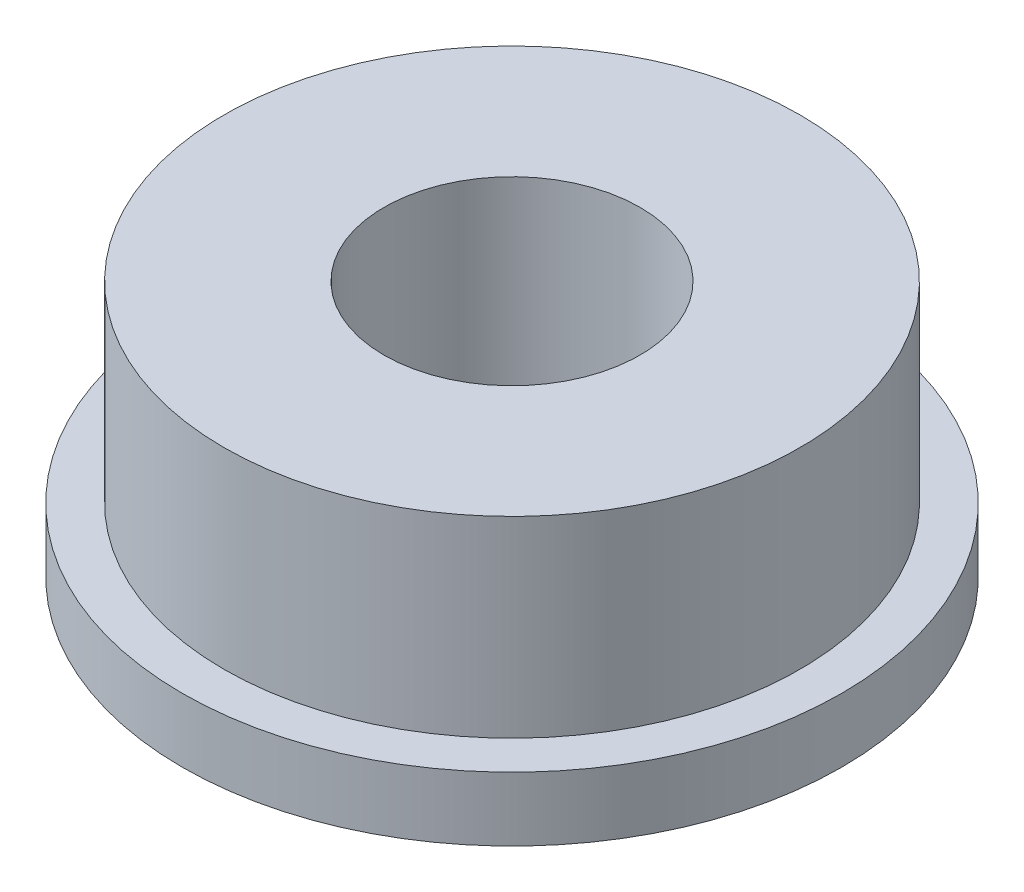
ISO-10303-21;
HEADER;
FILE_DESCRIPTION(('STEP AP214'),'2;1');
FILE_NAME('part.step','',(''),(''),'','','');
FILE_SCHEMA(('AUTOMOTIVE_DESIGN { 1 0 10303 214 1 1 1 1 }'));
ENDSEC;
DATA;
#1=APPLICATION_CONTEXT('core data for automotive mechanical design processes');
#2=APPLICATION_PROTOCOL_DEFINITION('international standard','automotive_design',2000,#1);
#3=PRODUCT_CONTEXT('',#1,'mechanical');
#4=PRODUCT('Part','Part','',(#3));
#5=PRODUCT_RELATED_PRODUCT_CATEGORY('part','',(#4));
#6=PRODUCT_DEFINITION_FORMATION('','',#4);
#7=PRODUCT_DEFINITION_CONTEXT('part definition',#1,'design');
#8=PRODUCT_DEFINITION('design','',#6,#7);
#9=PRODUCT_DEFINITION_SHAPE('','',#8);
#10=(LENGTH_UNIT() NAMED_UNIT(*) SI_UNIT(.MILLI.,.METRE.));
#11=(NAMED_UNIT(*) PLANE_ANGLE_UNIT() SI_UNIT($,.RADIAN.));
#12=(NAMED_UNIT(*) SI_UNIT($,.STERADIAN.) SOLID_ANGLE_UNIT());
#13=UNCERTAINTY_MEASURE_WITH_UNIT(LENGTH_MEASURE(1.E-05),#10,'distance_accuracy_value','');
#14=(GEOMETRIC_REPRESENTATION_CONTEXT(3) GLOBAL_UNCERTAINTY_ASSIGNED_CONTEXT((#13)) GLOBAL_UNIT_ASSIGNED_CONTEXT((#10,
#11,#12)) REPRESENTATION_CONTEXT('',''));
#15=CARTESIAN_POINT('',(0.,0.,0.));
#16=DIRECTION('',(0.,0.,1.));
#17=DIRECTION('',(1.,0.,0.));
#18=AXIS2_PLACEMENT_3D('',#15,#16,#17);
#19=CARTESIAN_POINT('',(0.,1.,0.));
#20=DIRECTION('',(0.,1.,0.));
#21=DIRECTION('',(0.,0.,1.));
#22=AXIS2_PLACEMENT_3D('',#19,#20,#21);
#23=PLANE('',#22);
#24=CARTESIAN_POINT('',(0.,1.,0.));
#25=DIRECTION('',(0.,1.,0.));
#26=DIRECTION('',(0.,0.,1.));
#27=AXIS2_PLACEMENT_3D('',#24,#25,#26);
#28=CIRCLE('',#27,5.15);
#29=CARTESIAN_POINT('',(0.,1.,5.15));
#30=VERTEX_POINT('',#29);
#31=EDGE_CURVE('E10',#30,#30,#28,.T.);
#32=ORIENTED_EDGE('',*,*,#31,.T.);
#33=EDGE_LOOP('',(#32));
#34=FACE_BOUND('',#33,.T.);
#35=CARTESIAN_POINT('',(0.,1.,0.));
#36=DIRECTION('',(0.,1.,0.));
#37=DIRECTION('',(0.,0.,1.));
#38=AXIS2_PLACEMENT_3D('',#35,#36,#37);
#39=CIRCLE('',#38,4.5);
#40=CARTESIAN_POINT('',(0.,1.,4.5));
#41=VERTEX_POINT('',#40);
#42=EDGE_CURVE('E48',#41,#41,#39,.T.);
#43=ORIENTED_EDGE('',*,*,#42,.F.);
#44=EDGE_LOOP('',(#43));
#45=FACE_BOUND('',#44,.T.);
#46=ADVANCED_FACE('F32',(#34,#45),#23,.T.);
#47=CARTESIAN_POINT('',(0.,0.,0.));
#48=DIRECTION('',(0.,1.,0.));
#49=DIRECTION('',(0.,0.,1.));
#50=AXIS2_PLACEMENT_3D('',#47,#48,#49);
#51=PLANE('',#50);
#52=CARTESIAN_POINT('',(0.,0.,0.));
#53=DIRECTION('',(0.,1.,0.));
#54=DIRECTION('',(0.,0.,1.));
#55=AXIS2_PLACEMENT_3D('',#52,#53,#54);
#56=CIRCLE('',#55,5.15);
#57=CARTESIAN_POINT('',(0.,0.,5.15));
#58=VERTEX_POINT('',#57);
#59=EDGE_CURVE('E36',#58,#58,#56,.T.);
#60=ORIENTED_EDGE('',*,*,#59,.F.);
#61=EDGE_LOOP('',(#60));
#62=FACE_BOUND('',#61,.T.);
#63=CARTESIAN_POINT('',(0.,0.,0.));
#64=DIRECTION('',(0.,1.,0.));
#65=DIRECTION('',(0.,0.,1.));
#66=AXIS2_PLACEMENT_3D('',#63,#64,#65);
#67=CIRCLE('',#66,2.);
#68=CARTESIAN_POINT('',(0.,0.,2.));
#69=VERTEX_POINT('',#68);
#70=EDGE_CURVE('E43',#69,#69,#67,.T.);
#71=ORIENTED_EDGE('',*,*,#70,.T.);
#72=EDGE_LOOP('',(#71));
#73=FACE_BOUND('',#72,.T.);
#74=ADVANCED_FACE('F73',(#62,#73),#51,.F.);
#75=CARTESIAN_POINT('',(0.,1.,0.));
#76=DIRECTION('',(0.,-1.,0.));
#77=DIRECTION('',(0.,0.,-1.));
#78=AXIS2_PLACEMENT_3D('',#75,#76,#77);
#79=CYLINDRICAL_SURFACE('',#78,5.15);
#80=ORIENTED_EDGE('',*,*,#31,.F.);
#81=EDGE_LOOP('',(#80));
#82=FACE_BOUND('',#81,.T.);
#83=ORIENTED_EDGE('',*,*,#59,.T.);
#84=EDGE_LOOP('',(#83));
#85=FACE_BOUND('',#84,.T.);
#86=ADVANCED_FACE('F34',(#82,#85),#79,.T.);
#87=CARTESIAN_POINT('',(0.,1.,0.));
#88=DIRECTION('',(0.,-1.,0.));
#89=DIRECTION('',(0.,0.,-1.));
#90=AXIS2_PLACEMENT_3D('',#87,#88,#89);
#91=CYLINDRICAL_SURFACE('',#90,2.);
#92=ORIENTED_EDGE('',*,*,#70,.F.);
#93=EDGE_LOOP('',(#92));
#94=FACE_BOUND('',#93,.T.);
#95=CARTESIAN_POINT('',(0.,4.,0.));
#96=DIRECTION('',(0.,1.,0.));
#97=DIRECTION('',(0.,0.,1.));
#98=AXIS2_PLACEMENT_3D('',#95,#96,#97);
#99=CIRCLE('',#98,2.);
#100=CARTESIAN_POINT('',(0.,4.,2.));
#101=VERTEX_POINT('',#100);
#102=EDGE_CURVE('E51',#101,#101,#99,.T.);
#103=ORIENTED_EDGE('',*,*,#102,.T.);
#104=EDGE_LOOP('',(#103));
#105=FACE_BOUND('',#104,.T.);
#106=ADVANCED_FACE('F57',(#94,#105),#91,.F.);
#107=CARTESIAN_POINT('',(0.,4.,0.));
#108=DIRECTION('',(0.,1.,0.));
#109=DIRECTION('',(0.,0.,1.));
#110=AXIS2_PLACEMENT_3D('',#107,#108,#109);
#111=PLANE('',#110);
#112=CARTESIAN_POINT('',(0.,4.,0.));
#113=DIRECTION('',(0.,1.,0.));
#114=DIRECTION('',(0.,0.,1.));
#115=AXIS2_PLACEMENT_3D('',#112,#113,#114);
#116=CIRCLE('',#115,4.5);
#117=CARTESIAN_POINT('',(0.,4.,4.5));
#118=VERTEX_POINT('',#117);
#119=EDGE_CURVE('E47',#118,#118,#116,.T.);
#120=ORIENTED_EDGE('',*,*,#119,.T.);
#121=EDGE_LOOP('',(#120));
#122=FACE_BOUND('',#121,.T.);
#123=ORIENTED_EDGE('',*,*,#102,.F.);
#124=EDGE_LOOP('',(#123));
#125=FACE_BOUND('',#124,.T.);
#126=ADVANCED_FACE('F59',(#122,#125),#111,.T.);
#127=CARTESIAN_POINT('',(0.,4.,0.));
#128=DIRECTION('',(0.,-1.,0.));
#129=DIRECTION('',(0.,0.,-1.));
#130=AXIS2_PLACEMENT_3D('',#127,#128,#129);
#131=CYLINDRICAL_SURFACE('',#130,4.5);
#132=ORIENTED_EDGE('',*,*,#119,.F.);
#133=EDGE_LOOP('',(#132));
#134=FACE_BOUND('',#133,.T.);
#135=ORIENTED_EDGE('',*,*,#42,.T.);
#136=EDGE_LOOP('',(#135));
#137=FACE_BOUND('',#136,.T.);
#138=ADVANCED_FACE('F61',(#134,#137),#131,.T.);
#139=CLOSED_SHELL('',(#46,#74,#86,#106,#126,#138));
#140=MANIFOLD_SOLID_BREP('B2',#139);
#141=ADVANCED_BREP_SHAPE_REPRESENTATION('',(#18,#140),#14);
#142=SHAPE_DEFINITION_REPRESENTATION(#9,#141);
ENDSEC;
END-ISO-10303-21;
